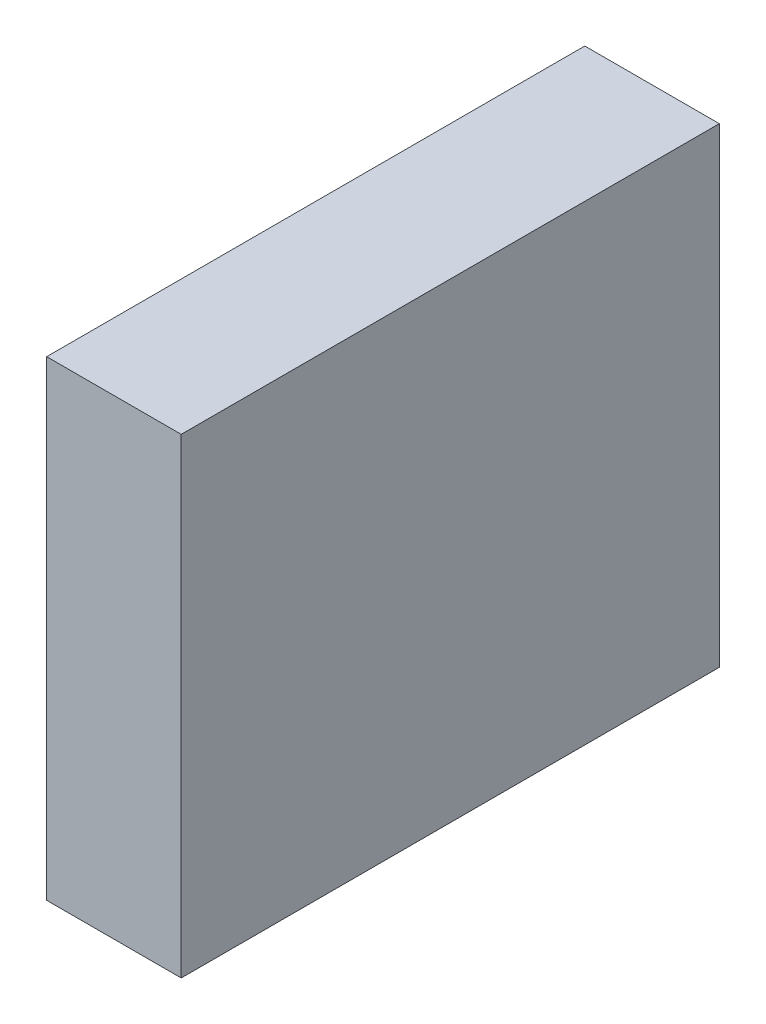
ISO-10303-21;
HEADER;
FILE_DESCRIPTION(('STEP AP214'),'2;1');
FILE_NAME('part.step','',(''),(''),'','','');
FILE_SCHEMA(('AUTOMOTIVE_DESIGN { 1 0 10303 214 1 1 1 1 }'));
ENDSEC;
DATA;
#1=APPLICATION_CONTEXT('core data for automotive mechanical design processes');
#2=APPLICATION_PROTOCOL_DEFINITION('international standard','automotive_design',2000,#1);
#3=PRODUCT_CONTEXT('',#1,'mechanical');
#4=PRODUCT('Part','Part','',(#3));
#5=PRODUCT_RELATED_PRODUCT_CATEGORY('part','',(#4));
#6=PRODUCT_DEFINITION_FORMATION('','',#4);
#7=PRODUCT_DEFINITION_CONTEXT('part definition',#1,'design');
#8=PRODUCT_DEFINITION('design','',#6,#7);
#9=PRODUCT_DEFINITION_SHAPE('','',#8);
#10=(LENGTH_UNIT() NAMED_UNIT(*) SI_UNIT(.MILLI.,.METRE.));
#11=(NAMED_UNIT(*) PLANE_ANGLE_UNIT() SI_UNIT($,.RADIAN.));
#12=(NAMED_UNIT(*) SI_UNIT($,.STERADIAN.) SOLID_ANGLE_UNIT());
#13=UNCERTAINTY_MEASURE_WITH_UNIT(LENGTH_MEASURE(1.E-05),#10,'distance_accuracy_value','');
#14=(GEOMETRIC_REPRESENTATION_CONTEXT(3) GLOBAL_UNCERTAINTY_ASSIGNED_CONTEXT((#13)) GLOBAL_UNIT_ASSIGNED_CONTEXT((#10,
#11,#12)) REPRESENTATION_CONTEXT('',''));
#15=CARTESIAN_POINT('',(0.,0.,0.));
#16=DIRECTION('',(0.,0.,1.));
#17=DIRECTION('',(1.,0.,0.));
#18=AXIS2_PLACEMENT_3D('',#15,#16,#17);
#19=CARTESIAN_POINT('',(5.,17.5,40.));
#20=DIRECTION('',(-1.,0.,0.));
#21=DIRECTION('',(0.,-1.,0.));
#22=AXIS2_PLACEMENT_3D('',#19,#20,#21);
#23=PLANE('',#22);
#24=DIRECTION('',(0.,1.,0.));
#25=VECTOR('',#24,1.);
#26=CARTESIAN_POINT('',(5.,17.5,0.));
#27=LINE('',#26,#25);
#28=CARTESIAN_POINT('',(5.,-17.5,0.));
#29=VERTEX_POINT('',#28);
#30=CARTESIAN_POINT('',(5.,17.5,0.));
#31=VERTEX_POINT('',#30);
#32=EDGE_CURVE('E123',#29,#31,#27,.T.);
#33=ORIENTED_EDGE('',*,*,#32,.T.);
#34=DIRECTION('',(0.,0.,-1.));
#35=VECTOR('',#34,1.);
#36=CARTESIAN_POINT('',(5.,17.5,40.));
#37=LINE('',#36,#35);
#38=CARTESIAN_POINT('',(5.,17.5,40.));
#39=VERTEX_POINT('',#38);
#40=EDGE_CURVE('E11',#39,#31,#37,.T.);
#41=ORIENTED_EDGE('',*,*,#40,.F.);
#42=DIRECTION('',(0.,1.,0.));
#43=VECTOR('',#42,1.);
#44=CARTESIAN_POINT('',(5.,17.5,40.));
#45=LINE('',#44,#43);
#46=CARTESIAN_POINT('',(5.,-17.5,40.));
#47=VERTEX_POINT('',#46);
#48=EDGE_CURVE('E124',#47,#39,#45,.T.);
#49=ORIENTED_EDGE('',*,*,#48,.F.);
#50=DIRECTION('',(0.,0.,-1.));
#51=VECTOR('',#50,1.);
#52=CARTESIAN_POINT('',(5.,-17.5,40.));
#53=LINE('',#52,#51);
#54=EDGE_CURVE('E130',#47,#29,#53,.T.);
#55=ORIENTED_EDGE('',*,*,#54,.T.);
#56=EDGE_LOOP('',(#33,#41,#49,#55));
#57=FACE_BOUND('',#56,.T.);
#58=ADVANCED_FACE('F43',(#57),#23,.F.);
#59=CARTESIAN_POINT('',(-5.,17.5,40.));
#60=DIRECTION('',(0.,-1.,0.));
#61=DIRECTION('',(0.,0.,-1.));
#62=AXIS2_PLACEMENT_3D('',#59,#60,#61);
#63=PLANE('',#62);
#64=DIRECTION('',(-1.,0.,0.));
#65=VECTOR('',#64,1.);
#66=CARTESIAN_POINT('',(-5.,17.5,0.));
#67=LINE('',#66,#65);
#68=CARTESIAN_POINT('',(-5.,17.5,0.));
#69=VERTEX_POINT('',#68);
#70=EDGE_CURVE('E133',#31,#69,#67,.T.);
#71=ORIENTED_EDGE('',*,*,#70,.T.);
#72=DIRECTION('',(0.,0.,-1.));
#73=VECTOR('',#72,1.);
#74=CARTESIAN_POINT('',(-5.,17.5,40.));
#75=LINE('',#74,#73);
#76=CARTESIAN_POINT('',(-5.,17.5,40.));
#77=VERTEX_POINT('',#76);
#78=EDGE_CURVE('E51',#77,#69,#75,.T.);
#79=ORIENTED_EDGE('',*,*,#78,.F.);
#80=DIRECTION('',(-1.,0.,0.));
#81=VECTOR('',#80,1.);
#82=CARTESIAN_POINT('',(-5.,17.5,40.));
#83=LINE('',#82,#81);
#84=EDGE_CURVE('E90',#39,#77,#83,.T.);
#85=ORIENTED_EDGE('',*,*,#84,.F.);
#86=ORIENTED_EDGE('',*,*,#40,.T.);
#87=EDGE_LOOP('',(#71,#79,#85,#86));
#88=FACE_BOUND('',#87,.T.);
#89=ADVANCED_FACE('F156',(#88),#63,.F.);
#90=CARTESIAN_POINT('',(-5.,17.5,40.));
#91=DIRECTION('',(1.,0.,0.));
#92=DIRECTION('',(0.,1.,0.));
#93=AXIS2_PLACEMENT_3D('',#90,#91,#92);
#94=PLANE('',#93);
#95=DIRECTION('',(0.,-1.,0.));
#96=VECTOR('',#95,1.);
#97=CARTESIAN_POINT('',(-5.,17.5,0.));
#98=LINE('',#97,#96);
#99=CARTESIAN_POINT('',(-5.,-17.5,0.));
#100=VERTEX_POINT('',#99);
#101=EDGE_CURVE('E77',#69,#100,#98,.T.);
#102=ORIENTED_EDGE('',*,*,#101,.T.);
#103=DIRECTION('',(0.,0.,-1.));
#104=VECTOR('',#103,1.);
#105=CARTESIAN_POINT('',(-5.,-17.5,40.));
#106=LINE('',#105,#104);
#107=CARTESIAN_POINT('',(-5.,-17.5,40.));
#108=VERTEX_POINT('',#107);
#109=EDGE_CURVE('E138',#108,#100,#106,.T.);
#110=ORIENTED_EDGE('',*,*,#109,.F.);
#111=DIRECTION('',(0.,-1.,0.));
#112=VECTOR('',#111,1.);
#113=CARTESIAN_POINT('',(-5.,17.5,40.));
#114=LINE('',#113,#112);
#115=EDGE_CURVE('E127',#77,#108,#114,.T.);
#116=ORIENTED_EDGE('',*,*,#115,.F.);
#117=ORIENTED_EDGE('',*,*,#78,.T.);
#118=EDGE_LOOP('',(#102,#110,#116,#117));
#119=FACE_BOUND('',#118,.T.);
#120=ADVANCED_FACE('F140',(#119),#94,.F.);
#121=CARTESIAN_POINT('',(-5.,-17.5,40.));
#122=DIRECTION('',(0.,1.,0.));
#123=DIRECTION('',(0.,0.,1.));
#124=AXIS2_PLACEMENT_3D('',#121,#122,#123);
#125=PLANE('',#124);
#126=DIRECTION('',(1.,0.,0.));
#127=VECTOR('',#126,1.);
#128=CARTESIAN_POINT('',(-5.,-17.5,0.));
#129=LINE('',#128,#127);
#130=EDGE_CURVE('E83',#100,#29,#129,.T.);
#131=ORIENTED_EDGE('',*,*,#130,.T.);
#132=ORIENTED_EDGE('',*,*,#54,.F.);
#133=DIRECTION('',(1.,0.,0.));
#134=VECTOR('',#133,1.);
#135=CARTESIAN_POINT('',(-5.,-17.5,40.));
#136=LINE('',#135,#134);
#137=EDGE_CURVE('E59',#108,#47,#136,.T.);
#138=ORIENTED_EDGE('',*,*,#137,.F.);
#139=ORIENTED_EDGE('',*,*,#109,.T.);
#140=EDGE_LOOP('',(#131,#132,#138,#139));
#141=FACE_BOUND('',#140,.T.);
#142=ADVANCED_FACE('F147',(#141),#125,.F.);
#143=CARTESIAN_POINT('',(0.,0.,40.));
#144=DIRECTION('',(0.,0.,1.));
#145=DIRECTION('',(1.,0.,0.));
#146=AXIS2_PLACEMENT_3D('',#143,#144,#145);
#147=PLANE('',#146);
#148=ORIENTED_EDGE('',*,*,#48,.T.);
#149=ORIENTED_EDGE('',*,*,#84,.T.);
#150=ORIENTED_EDGE('',*,*,#115,.T.);
#151=ORIENTED_EDGE('',*,*,#137,.T.);
#152=EDGE_LOOP('',(#148,#149,#150,#151));
#153=FACE_BOUND('',#152,.T.);
#154=ADVANCED_FACE('F149',(#153),#147,.T.);
#155=CARTESIAN_POINT('',(0.,0.,0.));
#156=DIRECTION('',(0.,0.,1.));
#157=DIRECTION('',(1.,0.,0.));
#158=AXIS2_PLACEMENT_3D('',#155,#156,#157);
#159=PLANE('',#158);
#160=CARTESIAN_POINT('',(0.,11.3549001279228,0.));
#161=DIRECTION('',(0.,0.,-1.));
#162=DIRECTION('',(-1.,0.,0.));
#163=AXIS2_PLACEMENT_3D('',#160,#161,#162);
#164=CIRCLE('',#163,1.525);
#165=CARTESIAN_POINT('',(-1.525,11.3549001279228,0.));
#166=VERTEX_POINT('',#165);
#167=EDGE_CURVE('E114',#166,#166,#164,.T.);
#168=ORIENTED_EDGE('',*,*,#167,.F.);
#169=EDGE_LOOP('',(#168));
#170=FACE_BOUND('',#169,.T.);
#171=CARTESIAN_POINT('',(0.,-11.3987414411578,0.));
#172=DIRECTION('',(0.,0.,-1.));
#173=DIRECTION('',(-1.,0.,0.));
#174=AXIS2_PLACEMENT_3D('',#171,#172,#173);
#175=CIRCLE('',#174,1.525);
#176=CARTESIAN_POINT('',(-1.525,-11.3987414411578,0.));
#177=VERTEX_POINT('',#176);
#178=EDGE_CURVE('E107',#177,#177,#175,.T.);
#179=ORIENTED_EDGE('',*,*,#178,.F.);
#180=EDGE_LOOP('',(#179));
#181=FACE_BOUND('',#180,.T.);
#182=ORIENTED_EDGE('',*,*,#32,.F.);
#183=ORIENTED_EDGE('',*,*,#130,.F.);
#184=ORIENTED_EDGE('',*,*,#101,.F.);
#185=ORIENTED_EDGE('',*,*,#70,.F.);
#186=EDGE_LOOP('',(#182,#183,#184,#185));
#187=FACE_BOUND('',#186,.T.);
#188=ADVANCED_FACE('F143',(#170,#181,#187),#159,.F.);
#189=CARTESIAN_POINT('',(0.,-11.3987414411578,11.));
#190=DIRECTION('',(0.,0.,-1.));
#191=DIRECTION('',(-1.,0.,0.));
#192=AXIS2_PLACEMENT_3D('',#189,#190,#191);
#193=CONICAL_SURFACE('',#192,1.25,1.02974425867665);
#194=CARTESIAN_POINT('',(0.,-11.3987414411578,11.7510757737845));
#195=VERTEX_POINT('',#194);
#196=VERTEX_LOOP('',#195);
#197=FACE_BOUND('',#196,.T.);
#198=CARTESIAN_POINT('',(0.,-11.3987414411578,11.));
#199=DIRECTION('',(0.,0.,-1.));
#200=DIRECTION('',(-1.,0.,0.));
#201=AXIS2_PLACEMENT_3D('',#198,#199,#200);
#202=CIRCLE('',#201,1.25);
#203=CARTESIAN_POINT('',(-1.25,-11.3987414411578,11.));
#204=VERTEX_POINT('',#203);
#205=EDGE_CURVE('E120',#204,#204,#202,.T.);
#206=ORIENTED_EDGE('',*,*,#205,.T.);
#207=EDGE_LOOP('',(#206));
#208=FACE_BOUND('',#207,.T.);
#209=ADVANCED_FACE('F189',(#197,#208),#193,.F.);
#210=CARTESIAN_POINT('',(0.,-11.3987414411578,0.));
#211=DIRECTION('',(0.,0.,-1.));
#212=DIRECTION('',(-1.,0.,0.));
#213=AXIS2_PLACEMENT_3D('',#210,#211,#212);
#214=CYLINDRICAL_SURFACE('',#213,1.24999999999999);
#215=ORIENTED_EDGE('',*,*,#205,.F.);
#216=EDGE_LOOP('',(#215));
#217=FACE_BOUND('',#216,.T.);
#218=CARTESIAN_POINT('',(0.,-11.3987414411578,0.274999999999997));
#219=DIRECTION('',(0.,0.,-1.));
#220=DIRECTION('',(-1.,0.,0.));
#221=AXIS2_PLACEMENT_3D('',#218,#219,#220);
#222=CIRCLE('',#221,1.24999999999999);
#223=CARTESIAN_POINT('',(-1.24999999999999,-11.3987414411578,0.274999999999997));
#224=VERTEX_POINT('',#223);
#225=EDGE_CURVE('E111',#224,#224,#222,.T.);
#226=ORIENTED_EDGE('',*,*,#225,.T.);
#227=EDGE_LOOP('',(#226));
#228=FACE_BOUND('',#227,.T.);
#229=ADVANCED_FACE('F201',(#217,#228),#214,.F.);
#230=CARTESIAN_POINT('',(0.,-11.3987414411578,0.));
#231=DIRECTION('',(0.,0.,-1.));
#232=DIRECTION('',(-1.,0.,0.));
#233=AXIS2_PLACEMENT_3D('',#230,#231,#232);
#234=CONICAL_SURFACE('',#233,1.525,0.78539816339747);
#235=ORIENTED_EDGE('',*,*,#225,.F.);
#236=EDGE_LOOP('',(#235));
#237=FACE_BOUND('',#236,.T.);
#238=ORIENTED_EDGE('',*,*,#178,.T.);
#239=EDGE_LOOP('',(#238));
#240=FACE_BOUND('',#239,.T.);
#241=ADVANCED_FACE('F101',(#237,#240),#234,.F.);
#242=CARTESIAN_POINT('',(0.,11.3549001279228,11.));
#243=DIRECTION('',(0.,0.,-1.));
#244=DIRECTION('',(-1.,0.,0.));
#245=AXIS2_PLACEMENT_3D('',#242,#243,#244);
#246=CONICAL_SURFACE('',#245,1.25,1.02974425867665);
#247=CARTESIAN_POINT('',(0.,11.3549001279228,11.7510757737845));
#248=VERTEX_POINT('',#247);
#249=VERTEX_LOOP('',#248);
#250=FACE_BOUND('',#249,.T.);
#251=CARTESIAN_POINT('',(0.,11.3549001279228,11.));
#252=DIRECTION('',(0.,0.,-1.));
#253=DIRECTION('',(-1.,0.,0.));
#254=AXIS2_PLACEMENT_3D('',#251,#252,#253);
#255=CIRCLE('',#254,1.25);
#256=CARTESIAN_POINT('',(-1.25,11.3549001279228,11.));
#257=VERTEX_POINT('',#256);
#258=EDGE_CURVE('E105',#257,#257,#255,.T.);
#259=ORIENTED_EDGE('',*,*,#258,.T.);
#260=EDGE_LOOP('',(#259));
#261=FACE_BOUND('',#260,.T.);
#262=ADVANCED_FACE('F97',(#250,#261),#246,.F.);
#263=CARTESIAN_POINT('',(0.,11.3549001279228,0.));
#264=DIRECTION('',(0.,0.,-1.));
#265=DIRECTION('',(-1.,0.,0.));
#266=AXIS2_PLACEMENT_3D('',#263,#264,#265);
#267=CYLINDRICAL_SURFACE('',#266,1.24999999999999);
#268=ORIENTED_EDGE('',*,*,#258,.F.);
#269=EDGE_LOOP('',(#268));
#270=FACE_BOUND('',#269,.T.);
#271=CARTESIAN_POINT('',(0.,11.3549001279228,0.274999999999997));
#272=DIRECTION('',(0.,0.,-1.));
#273=DIRECTION('',(-1.,0.,0.));
#274=AXIS2_PLACEMENT_3D('',#271,#272,#273);
#275=CIRCLE('',#274,1.24999999999999);
#276=CARTESIAN_POINT('',(-1.24999999999999,11.3549001279228,0.274999999999997));
#277=VERTEX_POINT('',#276);
#278=EDGE_CURVE('E108',#277,#277,#275,.T.);
#279=ORIENTED_EDGE('',*,*,#278,.T.);
#280=EDGE_LOOP('',(#279));
#281=FACE_BOUND('',#280,.T.);
#282=ADVANCED_FACE('F100',(#270,#281),#267,.F.);
#283=CARTESIAN_POINT('',(0.,11.3549001279228,0.));
#284=DIRECTION('',(0.,0.,-1.));
#285=DIRECTION('',(-1.,0.,0.));
#286=AXIS2_PLACEMENT_3D('',#283,#284,#285);
#287=CONICAL_SURFACE('',#286,1.525,0.78539816339747);
#288=ORIENTED_EDGE('',*,*,#278,.F.);
#289=EDGE_LOOP('',(#288));
#290=FACE_BOUND('',#289,.T.);
#291=ORIENTED_EDGE('',*,*,#167,.T.);
#292=EDGE_LOOP('',(#291));
#293=FACE_BOUND('',#292,.T.);
#294=ADVANCED_FACE('F239',(#290,#293),#287,.F.);
#295=CLOSED_SHELL('',(#58,#89,#120,#142,#154,#188,#209,#229,#241,#262,#282,#294));
#296=MANIFOLD_SOLID_BREP('B2',#295);
#297=ADVANCED_BREP_SHAPE_REPRESENTATION('',(#18,#296),#14);
#298=SHAPE_DEFINITION_REPRESENTATION(#9,#297);
ENDSEC;
END-ISO-10303-21;
